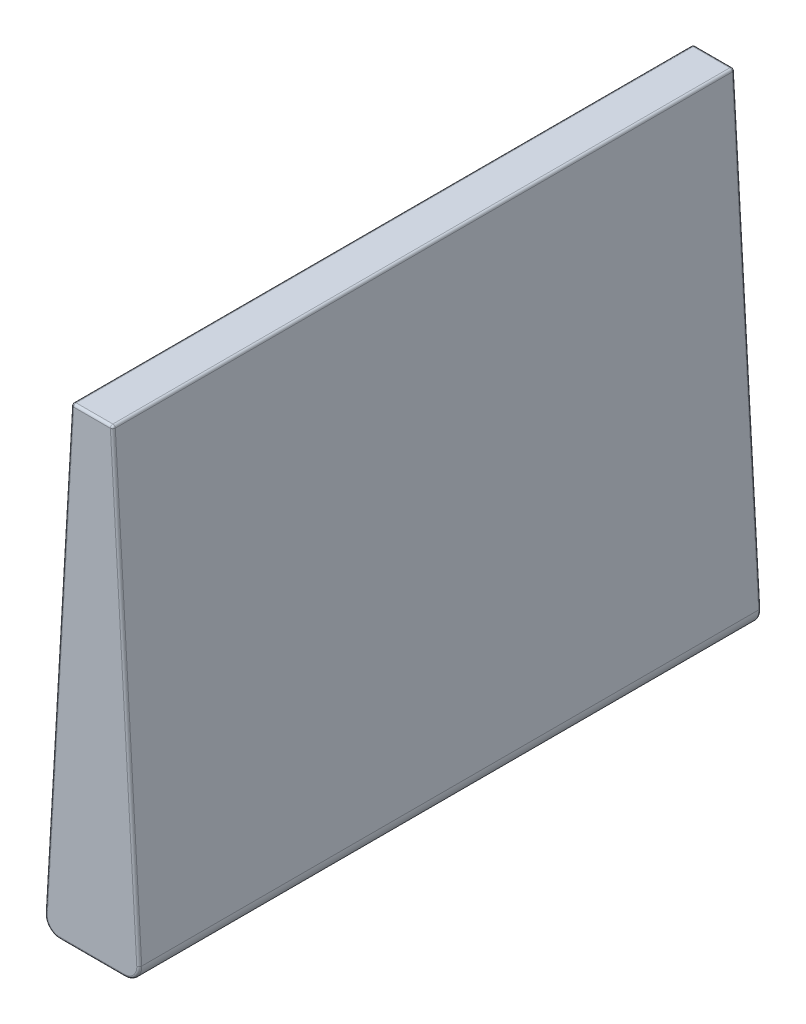
ISO-10303-21;
HEADER;
FILE_DESCRIPTION(('STEP AP214'),'2;1');
FILE_NAME('part.step','',(''),(''),'','','');
FILE_SCHEMA(('AUTOMOTIVE_DESIGN { 1 0 10303 214 1 1 1 1 }'));
ENDSEC;
DATA;
#1=APPLICATION_CONTEXT('core data for automotive mechanical design processes');
#2=APPLICATION_PROTOCOL_DEFINITION('international standard','automotive_design',2000,#1);
#3=PRODUCT_CONTEXT('',#1,'mechanical');
#4=PRODUCT('Part','Part','',(#3));
#5=PRODUCT_RELATED_PRODUCT_CATEGORY('part','',(#4));
#6=PRODUCT_DEFINITION_FORMATION('','',#4);
#7=PRODUCT_DEFINITION_CONTEXT('part definition',#1,'design');
#8=PRODUCT_DEFINITION('design','',#6,#7);
#9=PRODUCT_DEFINITION_SHAPE('','',#8);
#10=(LENGTH_UNIT() NAMED_UNIT(*) SI_UNIT(.MILLI.,.METRE.));
#11=(NAMED_UNIT(*) PLANE_ANGLE_UNIT() SI_UNIT($,.RADIAN.));
#12=(NAMED_UNIT(*) SI_UNIT($,.STERADIAN.) SOLID_ANGLE_UNIT());
#13=UNCERTAINTY_MEASURE_WITH_UNIT(LENGTH_MEASURE(1.E-05),#10,'distance_accuracy_value','');
#14=(GEOMETRIC_REPRESENTATION_CONTEXT(3) GLOBAL_UNCERTAINTY_ASSIGNED_CONTEXT((#13)) GLOBAL_UNIT_ASSIGNED_CONTEXT((#10,
#11,#12)) REPRESENTATION_CONTEXT('',''));
#15=CARTESIAN_POINT('',(0.,0.,0.));
#16=DIRECTION('',(0.,0.,1.));
#17=DIRECTION('',(1.,0.,0.));
#18=AXIS2_PLACEMENT_3D('',#15,#16,#17);
#19=CARTESIAN_POINT('',(454.302847130838,385.661126294718,239.77));
#20=DIRECTION('',(-1.,0.,0.));
#21=DIRECTION('',(0.,-1.,0.));
#22=AXIS2_PLACEMENT_3D('',#19,#20,#21);
#23=SPHERICAL_SURFACE('',#22,3.);
#24=CARTESIAN_POINT('',(454.302847130838,385.661126294718,239.77));
#25=DIRECTION('',(0.,0.,-1.));
#26=DIRECTION('',(-1.,0.,0.));
#27=AXIS2_PLACEMENT_3D('',#24,#25,#26);
#28=CIRCLE('',#27,3.);
#29=CARTESIAN_POINT('',(451.307938308074,385.835829309379,239.77));
#30=VERTEX_POINT('',#29);
#31=CARTESIAN_POINT('',(454.302847130838,388.661126294718,239.77));
#32=VERTEX_POINT('',#31);
#33=EDGE_CURVE('E128',#30,#32,#28,.T.);
#34=ORIENTED_EDGE('',*,*,#33,.F.);
#35=CARTESIAN_POINT('',(454.302847130838,385.661126294718,239.77));
#36=DIRECTION('',(0.0582343382204067,0.998302940921257,0.));
#37=DIRECTION('',(-0.998302940921257,0.0582343382204067,0.));
#38=AXIS2_PLACEMENT_3D('',#35,#36,#37);
#39=CIRCLE('',#38,3.);
#40=CARTESIAN_POINT('',(454.302847130838,385.661126294718,242.77));
#41=VERTEX_POINT('',#40);
#42=EDGE_CURVE('E21',#41,#30,#39,.F.);
#43=ORIENTED_EDGE('',*,*,#42,.F.);
#44=CARTESIAN_POINT('',(454.302847130838,385.661126294718,239.77));
#45=DIRECTION('',(-1.,0.,0.));
#46=DIRECTION('',(0.,0.,1.));
#47=AXIS2_PLACEMENT_3D('',#44,#45,#46);
#48=CIRCLE('',#47,3.);
#49=EDGE_CURVE('E117',#32,#41,#48,.F.);
#50=ORIENTED_EDGE('',*,*,#49,.F.);
#51=EDGE_LOOP('',(#34,#43,#50));
#52=FACE_BOUND('',#51,.T.);
#53=ADVANCED_FACE('F17',(#52),#23,.T.);
#54=CARTESIAN_POINT('',(454.302847130838,385.661126294718,-507.67));
#55=DIRECTION('',(-0.0582343382204347,-0.998302940921256,0.));
#56=DIRECTION('',(0.,0.,1.));
#57=AXIS2_PLACEMENT_3D('',#54,#55,#56);
#58=SPHERICAL_SURFACE('',#57,3.);
#59=CARTESIAN_POINT('',(454.302847130838,385.661126294718,-507.67));
#60=DIRECTION('',(1.,0.,0.));
#61=DIRECTION('',(0.,0.,-1.));
#62=AXIS2_PLACEMENT_3D('',#59,#60,#61);
#63=CIRCLE('',#62,3.);
#64=CARTESIAN_POINT('',(454.302847130838,385.661126294718,-510.67));
#65=VERTEX_POINT('',#64);
#66=CARTESIAN_POINT('',(454.302847130838,388.661126294718,-507.67));
#67=VERTEX_POINT('',#66);
#68=EDGE_CURVE('E252',#65,#67,#63,.T.);
#69=ORIENTED_EDGE('',*,*,#68,.F.);
#70=CARTESIAN_POINT('',(454.302847130838,385.661126294718,-507.67));
#71=DIRECTION('',(-0.0582343382204067,-0.998302940921257,0.));
#72=DIRECTION('',(0.998302940921257,-0.0582343382204067,0.));
#73=AXIS2_PLACEMENT_3D('',#70,#71,#72);
#74=CIRCLE('',#73,3.);
#75=CARTESIAN_POINT('',(451.307938308074,385.835829309379,-507.67));
#76=VERTEX_POINT('',#75);
#77=EDGE_CURVE('E253',#76,#65,#74,.T.);
#78=ORIENTED_EDGE('',*,*,#77,.F.);
#79=CARTESIAN_POINT('',(454.302847130838,385.661126294718,-507.67));
#80=DIRECTION('',(0.,0.,-1.));
#81=DIRECTION('',(-1.,0.,0.));
#82=AXIS2_PLACEMENT_3D('',#79,#80,#81);
#83=CIRCLE('',#82,3.);
#84=EDGE_CURVE('E265',#67,#76,#83,.F.);
#85=ORIENTED_EDGE('',*,*,#84,.F.);
#86=EDGE_LOOP('',(#69,#78,#85));
#87=FACE_BOUND('',#86,.T.);
#88=ADVANCED_FACE('F306',(#87),#58,.T.);
#89=CARTESIAN_POINT('',(451.510652388512,389.310927831157,-513.95));
#90=DIRECTION('',(0.998302940921257,-0.0582343382204067,0.));
#91=DIRECTION('',(0.0582343382204067,0.998302940921257,0.));
#92=AXIS2_PLACEMENT_3D('',#89,#90,#91);
#93=PLANE('',#92);
#94=DIRECTION('',(0.,0.,-1.));
#95=VECTOR('',#94,1.);
#96=CARTESIAN_POINT('',(451.307938308074,385.835829309379,-513.95));
#97=LINE('',#96,#95);
#98=EDGE_CURVE('E267',#76,#30,#97,.F.);
#99=ORIENTED_EDGE('',*,*,#98,.F.);
#100=DIRECTION('',(-0.0582343382204067,-0.998302940921257,0.));
#101=VECTOR('',#100,1.);
#102=CARTESIAN_POINT('',(434.772490193528,102.37100448859,-507.67));
#103=LINE('',#102,#101);
#104=CARTESIAN_POINT('',(419.31785168735,-162.565655617315,-507.67));
#105=VERTEX_POINT('',#104);
#106=EDGE_CURVE('E127',#105,#76,#103,.F.);
#107=ORIENTED_EDGE('',*,*,#106,.F.);
#108=DIRECTION('',(0.,0.,1.));
#109=VECTOR('',#108,1.);
#110=CARTESIAN_POINT('',(419.31785168735,-162.565655617315,-513.95));
#111=LINE('',#110,#109);
#112=CARTESIAN_POINT('',(419.31785168735,-162.565655617315,239.77));
#113=VERTEX_POINT('',#112);
#114=EDGE_CURVE('E296',#113,#105,#111,.F.);
#115=ORIENTED_EDGE('',*,*,#114,.F.);
#116=DIRECTION('',(0.0582343382204067,0.998302940921257,0.));
#117=VECTOR('',#116,1.);
#118=CARTESIAN_POINT('',(434.772490193528,102.37100448859,239.77));
#119=LINE('',#118,#117);
#120=EDGE_CURVE('E134',#30,#113,#119,.F.);
#121=ORIENTED_EDGE('',*,*,#120,.F.);
#122=EDGE_LOOP('',(#99,#107,#115,#121));
#123=FACE_BOUND('',#122,.T.);
#124=ADVANCED_FACE('F309',(#123),#93,.F.);
#125=CARTESIAN_POINT('',(476.510652388512,-175.613873705282,-133.95));
#126=DIRECTION('',(0.,-1.,0.));
#127=DIRECTION('',(0.,0.,-1.));
#128=AXIS2_PLACEMENT_3D('',#125,#126,#127);
#129=PLANE('',#128);
#130=CARTESIAN_POINT('',(476.510652388512,-175.613873705282,233.019999963041));
#131=DIRECTION('',(0.,-1.,0.));
#132=DIRECTION('',(0.,0.,-1.));
#133=AXIS2_PLACEMENT_3D('',#130,#131,#132);
#134=CIRCLE('',#133,2.75);
#135=CARTESIAN_POINT('',(476.510652388512,-175.613873705282,230.269999963041));
#136=VERTEX_POINT('',#135);
#137=EDGE_CURVE('E506',#136,#136,#134,.T.);
#138=ORIENTED_EDGE('',*,*,#137,.T.);
#139=EDGE_LOOP('',(#138));
#140=FACE_BOUND('',#139,.T.);
#141=ADVANCED_FACE('F313',(#140),#129,.T.);
#142=CARTESIAN_POINT('',(476.510652388512,-175.613873705282,-133.95));
#143=DIRECTION('',(0.,-1.,0.));
#144=DIRECTION('',(0.,0.,-1.));
#145=AXIS2_PLACEMENT_3D('',#142,#143,#144);
#146=PLANE('',#145);
#147=CARTESIAN_POINT('',(476.510652388512,-175.613873705282,-500.919999963041));
#148=DIRECTION('',(0.,-1.,0.));
#149=DIRECTION('',(0.,0.,-1.));
#150=AXIS2_PLACEMENT_3D('',#147,#148,#149);
#151=CIRCLE('',#150,2.75);
#152=CARTESIAN_POINT('',(476.510652388512,-175.613873705282,-503.669999963041));
#153=VERTEX_POINT('',#152);
#154=EDGE_CURVE('E151',#153,#153,#151,.T.);
#155=ORIENTED_EDGE('',*,*,#154,.T.);
#156=EDGE_LOOP('',(#155));
#157=FACE_BOUND('',#156,.T.);
#158=ADVANCED_FACE('F316',(#157),#146,.T.);
#159=CARTESIAN_POINT('',(437.767399016292,102.196301473929,239.77));
#160=DIRECTION('',(0.0582343382204067,0.998302940921257,0.));
#161=DIRECTION('',(-0.998302940921257,0.0582343382204067,0.));
#162=AXIS2_PLACEMENT_3D('',#159,#160,#161);
#163=CYLINDRICAL_SURFACE('',#162,3.);
#164=ORIENTED_EDGE('',*,*,#120,.T.);
#165=CARTESIAN_POINT('',(422.312760510114,-162.740358631976,239.77));
#166=DIRECTION('',(-0.0582343382204011,-0.998302940921258,0.));
#167=DIRECTION('',(-0.998302940921258,0.0582343382204011,0.));
#168=AXIS2_PLACEMENT_3D('',#165,#166,#167);
#169=CIRCLE('',#168,3.);
#170=CARTESIAN_POINT('',(422.312760510114,-162.740358631976,242.77));
#171=VERTEX_POINT('',#170);
#172=EDGE_CURVE('E146',#171,#113,#169,.T.);
#173=ORIENTED_EDGE('',*,*,#172,.F.);
#174=DIRECTION('',(-0.058234338220407,-0.998302940921257,0.));
#175=VECTOR('',#174,1.);
#176=CARTESIAN_POINT('',(454.302847130838,385.661126294718,242.77));
#177=LINE('',#176,#175);
#178=EDGE_CURVE('E137',#41,#171,#177,.T.);
#179=ORIENTED_EDGE('',*,*,#178,.F.);
#180=ORIENTED_EDGE('',*,*,#42,.T.);
#181=EDGE_LOOP('',(#164,#173,#179,#180));
#182=FACE_BOUND('',#181,.T.);
#183=ADVANCED_FACE('F144',(#182),#163,.T.);
#184=CARTESIAN_POINT('',(437.287304623933,-163.613873705282,239.77));
#185=DIRECTION('',(0.,0.,1.));
#186=DIRECTION('',(-1.,0.,0.));
#187=AXIS2_PLACEMENT_3D('',#184,#185,#186);
#188=TOROIDAL_SURFACE('',#187,15.,3.);
#189=CARTESIAN_POINT('',(437.287304623933,-163.613873705282,242.77));
#190=DIRECTION('',(0.,0.,-1.));
#191=DIRECTION('',(0.,-1.,0.));
#192=AXIS2_PLACEMENT_3D('',#189,#190,#191);
#193=CIRCLE('',#192,15.);
#194=CARTESIAN_POINT('',(437.287304623933,-178.613873705282,242.77));
#195=VERTEX_POINT('',#194);
#196=EDGE_CURVE('E148',#171,#195,#193,.F.);
#197=ORIENTED_EDGE('',*,*,#196,.F.);
#198=ORIENTED_EDGE('',*,*,#172,.T.);
#199=CARTESIAN_POINT('',(437.287304623933,-163.613873705282,239.77));
#200=DIRECTION('',(0.,0.,1.));
#201=DIRECTION('',(1.,0.,0.));
#202=AXIS2_PLACEMENT_3D('',#199,#200,#201);
#203=CIRCLE('',#202,18.);
#204=CARTESIAN_POINT('',(437.287304623933,-181.613873705282,239.77));
#205=VERTEX_POINT('',#204);
#206=EDGE_CURVE('E300',#205,#113,#203,.F.);
#207=ORIENTED_EDGE('',*,*,#206,.F.);
#208=CARTESIAN_POINT('',(437.287304623933,-178.613873705282,239.77));
#209=DIRECTION('',(1.,0.,0.));
#210=DIRECTION('',(0.,0.,-1.));
#211=AXIS2_PLACEMENT_3D('',#208,#209,#210);
#212=CIRCLE('',#211,3.);
#213=EDGE_CURVE('E470',#195,#205,#212,.T.);
#214=ORIENTED_EDGE('',*,*,#213,.F.);
#215=EDGE_LOOP('',(#197,#198,#207,#214));
#216=FACE_BOUND('',#215,.T.);
#217=ADVANCED_FACE('F277',(#216),#188,.T.);
#218=CARTESIAN_POINT('',(454.302847130838,385.661126294718,-513.95));
#219=DIRECTION('',(0.,0.,-1.));
#220=DIRECTION('',(-1.,0.,0.));
#221=AXIS2_PLACEMENT_3D('',#218,#219,#220);
#222=CYLINDRICAL_SURFACE('',#221,3.);
#223=ORIENTED_EDGE('',*,*,#33,.T.);
#224=DIRECTION('',(0.,0.,1.));
#225=VECTOR('',#224,1.);
#226=CARTESIAN_POINT('',(454.302847130838,388.661126294718,-133.95));
#227=LINE('',#226,#225);
#228=EDGE_CURVE('E141',#67,#32,#227,.T.);
#229=ORIENTED_EDGE('',*,*,#228,.F.);
#230=ORIENTED_EDGE('',*,*,#84,.T.);
#231=ORIENTED_EDGE('',*,*,#98,.T.);
#232=EDGE_LOOP('',(#223,#229,#230,#231));
#233=FACE_BOUND('',#232,.T.);
#234=ADVANCED_FACE('F282',(#233),#222,.T.);
#235=CARTESIAN_POINT('',(476.510652388512,385.661126294718,239.77));
#236=DIRECTION('',(-1.,0.,0.));
#237=DIRECTION('',(0.,0.,1.));
#238=AXIS2_PLACEMENT_3D('',#235,#236,#237);
#239=CYLINDRICAL_SURFACE('',#238,3.);
#240=CARTESIAN_POINT('',(498.718457646185,385.661126294718,239.77));
#241=DIRECTION('',(-1.,0.,0.));
#242=DIRECTION('',(0.,-1.,0.));
#243=AXIS2_PLACEMENT_3D('',#240,#241,#242);
#244=CIRCLE('',#243,3.);
#245=CARTESIAN_POINT('',(498.718457646185,388.661126294718,239.77));
#246=VERTEX_POINT('',#245);
#247=CARTESIAN_POINT('',(498.718457646185,385.661126294718,242.77));
#248=VERTEX_POINT('',#247);
#249=EDGE_CURVE('E405',#246,#248,#244,.F.);
#250=ORIENTED_EDGE('',*,*,#249,.F.);
#251=DIRECTION('',(1.,0.,0.));
#252=VECTOR('',#251,1.);
#253=CARTESIAN_POINT('',(495.010652388512,388.661126294718,239.77));
#254=LINE('',#253,#252);
#255=EDGE_CURVE('E124',#32,#246,#254,.T.);
#256=ORIENTED_EDGE('',*,*,#255,.F.);
#257=ORIENTED_EDGE('',*,*,#49,.T.);
#258=DIRECTION('',(1.,0.,0.));
#259=VECTOR('',#258,1.);
#260=CARTESIAN_POINT('',(510.956219503305,385.661126294718,242.77));
#261=LINE('',#260,#259);
#262=EDGE_CURVE('E122',#248,#41,#261,.F.);
#263=ORIENTED_EDGE('',*,*,#262,.F.);
#264=EDGE_LOOP('',(#250,#256,#257,#263));
#265=FACE_BOUND('',#264,.T.);
#266=ADVANCED_FACE('F120',(#265),#239,.T.);
#267=CARTESIAN_POINT('',(437.767399016292,102.196301473929,-507.67));
#268=DIRECTION('',(-0.0582343382204067,-0.998302940921257,0.));
#269=DIRECTION('',(0.998302940921257,-0.0582343382204067,0.));
#270=AXIS2_PLACEMENT_3D('',#267,#268,#269);
#271=CYLINDRICAL_SURFACE('',#270,3.);
#272=ORIENTED_EDGE('',*,*,#106,.T.);
#273=ORIENTED_EDGE('',*,*,#77,.T.);
#274=DIRECTION('',(0.058234338220407,0.998302940921257,0.));
#275=VECTOR('',#274,1.);
#276=CARTESIAN_POINT('',(422.312760510114,-162.740358631976,-510.67));
#277=LINE('',#276,#275);
#278=CARTESIAN_POINT('',(422.312760510114,-162.740358631976,-510.67));
#279=VERTEX_POINT('',#278);
#280=EDGE_CURVE('E402',#279,#65,#277,.T.);
#281=ORIENTED_EDGE('',*,*,#280,.F.);
#282=CARTESIAN_POINT('',(422.312760510114,-162.740358631976,-507.67));
#283=DIRECTION('',(-0.0582343382203922,-0.998302940921258,0.));
#284=DIRECTION('',(-0.998302940921258,0.0582343382203922,0.));
#285=AXIS2_PLACEMENT_3D('',#282,#283,#284);
#286=CIRCLE('',#285,3.);
#287=EDGE_CURVE('E245',#105,#279,#286,.T.);
#288=ORIENTED_EDGE('',*,*,#287,.F.);
#289=EDGE_LOOP('',(#272,#273,#281,#288));
#290=FACE_BOUND('',#289,.T.);
#291=ADVANCED_FACE('F238',(#290),#271,.T.);
#292=CARTESIAN_POINT('',(437.287304623933,-163.613873705282,-507.67));
#293=DIRECTION('',(0.,0.,1.));
#294=DIRECTION('',(-1.,0.,0.));
#295=AXIS2_PLACEMENT_3D('',#292,#293,#294);
#296=TOROIDAL_SURFACE('',#295,15.,3.);
#297=CARTESIAN_POINT('',(437.287304623933,-163.613873705282,-510.67));
#298=DIRECTION('',(0.,0.,1.));
#299=DIRECTION('',(-0.998302940921258,0.0582343382203918,0.));
#300=AXIS2_PLACEMENT_3D('',#297,#298,#299);
#301=CIRCLE('',#300,15.0000000000001);
#302=CARTESIAN_POINT('',(437.287304623933,-178.613873705282,-510.67));
#303=VERTEX_POINT('',#302);
#304=EDGE_CURVE('E398',#303,#279,#301,.F.);
#305=ORIENTED_EDGE('',*,*,#304,.F.);
#306=CARTESIAN_POINT('',(437.287304623933,-178.613873705282,-507.67));
#307=DIRECTION('',(-1.,0.,0.));
#308=DIRECTION('',(0.,0.,1.));
#309=AXIS2_PLACEMENT_3D('',#306,#307,#308);
#310=CIRCLE('',#309,3.);
#311=CARTESIAN_POINT('',(437.287304623933,-181.613873705282,-507.67));
#312=VERTEX_POINT('',#311);
#313=EDGE_CURVE('E149',#312,#303,#310,.F.);
#314=ORIENTED_EDGE('',*,*,#313,.F.);
#315=CARTESIAN_POINT('',(437.287304623933,-163.613873705282,-507.67));
#316=DIRECTION('',(0.,0.,1.));
#317=DIRECTION('',(1.,0.,0.));
#318=AXIS2_PLACEMENT_3D('',#315,#316,#317);
#319=CIRCLE('',#318,18.);
#320=EDGE_CURVE('E299',#105,#312,#319,.T.);
#321=ORIENTED_EDGE('',*,*,#320,.F.);
#322=ORIENTED_EDGE('',*,*,#287,.T.);
#323=EDGE_LOOP('',(#305,#314,#321,#322));
#324=FACE_BOUND('',#323,.T.);
#325=ADVANCED_FACE('F232',(#324),#296,.T.);
#326=CARTESIAN_POINT('',(476.510652388512,385.661126294718,-507.67));
#327=DIRECTION('',(1.,0.,0.));
#328=DIRECTION('',(0.,0.,-1.));
#329=AXIS2_PLACEMENT_3D('',#326,#327,#328);
#330=CYLINDRICAL_SURFACE('',#329,3.);
#331=ORIENTED_EDGE('',*,*,#68,.T.);
#332=DIRECTION('',(1.,0.,0.));
#333=VECTOR('',#332,1.);
#334=CARTESIAN_POINT('',(495.010652388512,388.661126294718,-507.67));
#335=LINE('',#334,#333);
#336=CARTESIAN_POINT('',(498.718457646185,388.661126294718,-507.67));
#337=VERTEX_POINT('',#336);
#338=EDGE_CURVE('E419',#337,#67,#335,.F.);
#339=ORIENTED_EDGE('',*,*,#338,.F.);
#340=CARTESIAN_POINT('',(498.718457646185,385.661126294718,-507.67));
#341=DIRECTION('',(1.,0.,0.));
#342=DIRECTION('',(0.,-1.,0.));
#343=AXIS2_PLACEMENT_3D('',#340,#341,#342);
#344=CIRCLE('',#343,3.);
#345=CARTESIAN_POINT('',(498.718457646186,385.66112629472,-510.67));
#346=VERTEX_POINT('',#345);
#347=EDGE_CURVE('E464',#346,#337,#344,.T.);
#348=ORIENTED_EDGE('',*,*,#347,.F.);
#349=DIRECTION('',(-1.,0.,0.));
#350=VECTOR('',#349,1.);
#351=CARTESIAN_POINT('',(442.065085273718,385.661126294718,-510.67));
#352=LINE('',#351,#350);
#353=EDGE_CURVE('E399',#65,#346,#352,.F.);
#354=ORIENTED_EDGE('',*,*,#353,.F.);
#355=EDGE_LOOP('',(#331,#339,#348,#354));
#356=FACE_BOUND('',#355,.T.);
#357=ADVANCED_FACE('F237',(#356),#330,.T.);
#358=CARTESIAN_POINT('',(437.287304623933,-163.613873705282,-513.95));
#359=DIRECTION('',(0.,0.,1.));
#360=DIRECTION('',(1.,0.,0.));
#361=AXIS2_PLACEMENT_3D('',#358,#359,#360);
#362=CYLINDRICAL_SURFACE('',#361,18.);
#363=ORIENTED_EDGE('',*,*,#320,.T.);
#364=DIRECTION('',(0.,0.,-1.));
#365=VECTOR('',#364,1.);
#366=CARTESIAN_POINT('',(437.287304623933,-181.613873705282,-133.95));
#367=LINE('',#366,#365);
#368=EDGE_CURVE('E223',#205,#312,#367,.T.);
#369=ORIENTED_EDGE('',*,*,#368,.F.);
#370=ORIENTED_EDGE('',*,*,#206,.T.);
#371=ORIENTED_EDGE('',*,*,#114,.T.);
#372=EDGE_LOOP('',(#363,#369,#370,#371));
#373=FACE_BOUND('',#372,.T.);
#374=ADVANCED_FACE('F554',(#373),#362,.T.);
#375=CARTESIAN_POINT('',(476.510652388512,-178.613873705282,239.77));
#376=DIRECTION('',(1.,0.,0.));
#377=DIRECTION('',(0.,0.,-1.));
#378=AXIS2_PLACEMENT_3D('',#375,#376,#377);
#379=CYLINDRICAL_SURFACE('',#378,3.);
#380=DIRECTION('',(1.,0.,0.));
#381=VECTOR('',#380,1.);
#382=CARTESIAN_POINT('',(447.804380484607,-181.613873705282,239.77));
#383=LINE('',#382,#381);
#384=CARTESIAN_POINT('',(515.73400015309,-181.613873705282,239.77));
#385=VERTEX_POINT('',#384);
#386=EDGE_CURVE('E468',#385,#205,#383,.F.);
#387=ORIENTED_EDGE('',*,*,#386,.F.);
#388=CARTESIAN_POINT('',(515.73400015309,-178.613873705282,239.77));
#389=DIRECTION('',(1.,0.,0.));
#390=DIRECTION('',(0.,-1.,0.));
#391=AXIS2_PLACEMENT_3D('',#388,#389,#390);
#392=CIRCLE('',#391,3.);
#393=CARTESIAN_POINT('',(515.73400015309,-178.613873705282,242.77));
#394=VERTEX_POINT('',#393);
#395=EDGE_CURVE('E216',#394,#385,#392,.T.);
#396=ORIENTED_EDGE('',*,*,#395,.F.);
#397=DIRECTION('',(1.,0.,0.));
#398=VECTOR('',#397,1.);
#399=CARTESIAN_POINT('',(510.956219503305,-178.613873705282,242.77));
#400=LINE('',#399,#398);
#401=EDGE_CURVE('E142',#195,#394,#400,.T.);
#402=ORIENTED_EDGE('',*,*,#401,.F.);
#403=ORIENTED_EDGE('',*,*,#213,.T.);
#404=EDGE_LOOP('',(#387,#396,#402,#403));
#405=FACE_BOUND('',#404,.T.);
#406=ADVANCED_FACE('F466',(#405),#379,.T.);
#407=CARTESIAN_POINT('',(476.510652388512,-183.213873705282,233.019999963041));
#408=DIRECTION('',(0.,-1.,0.));
#409=DIRECTION('',(0.,0.,-1.));
#410=AXIS2_PLACEMENT_3D('',#407,#408,#409);
#411=CYLINDRICAL_SURFACE('',#410,2.75);
#412=CARTESIAN_POINT('',(476.510652388512,-181.613873705282,233.019999963041));
#413=DIRECTION('',(0.,-1.,0.));
#414=DIRECTION('',(0.,0.,-1.));
#415=AXIS2_PLACEMENT_3D('',#412,#413,#414);
#416=CIRCLE('',#415,2.75);
#417=CARTESIAN_POINT('',(476.510652388512,-181.613873705282,230.269999963041));
#418=VERTEX_POINT('',#417);
#419=EDGE_CURVE('E475',#418,#418,#416,.F.);
#420=ORIENTED_EDGE('',*,*,#419,.F.);
#421=EDGE_LOOP('',(#420));
#422=FACE_BOUND('',#421,.T.);
#423=ORIENTED_EDGE('',*,*,#137,.F.);
#424=EDGE_LOOP('',(#423));
#425=FACE_BOUND('',#424,.T.);
#426=ADVANCED_FACE('F544',(#422,#425),#411,.F.);
#427=CARTESIAN_POINT('',(476.510652388512,-183.213873705282,-500.919999963041));
#428=DIRECTION('',(0.,-1.,0.));
#429=DIRECTION('',(0.,0.,-1.));
#430=AXIS2_PLACEMENT_3D('',#427,#428,#429);
#431=CYLINDRICAL_SURFACE('',#430,2.75);
#432=CARTESIAN_POINT('',(476.510652388512,-181.613873705282,-500.919999963041));
#433=DIRECTION('',(0.,-1.,0.));
#434=DIRECTION('',(0.,0.,-1.));
#435=AXIS2_PLACEMENT_3D('',#432,#433,#434);
#436=CIRCLE('',#435,2.75);
#437=CARTESIAN_POINT('',(476.510652388512,-181.613873705282,-503.669999963041));
#438=VERTEX_POINT('',#437);
#439=EDGE_CURVE('E538',#438,#438,#436,.F.);
#440=ORIENTED_EDGE('',*,*,#439,.F.);
#441=EDGE_LOOP('',(#440));
#442=FACE_BOUND('',#441,.T.);
#443=ORIENTED_EDGE('',*,*,#154,.F.);
#444=EDGE_LOOP('',(#443));
#445=FACE_BOUND('',#444,.T.);
#446=ADVANCED_FACE('F547',(#442,#445),#431,.F.);
#447=CARTESIAN_POINT('',(476.510652388512,-178.613873705282,-507.67));
#448=DIRECTION('',(-1.,0.,0.));
#449=DIRECTION('',(0.,0.,1.));
#450=AXIS2_PLACEMENT_3D('',#447,#448,#449);
#451=CYLINDRICAL_SURFACE('',#450,3.);
#452=DIRECTION('',(1.,0.,0.));
#453=VECTOR('',#452,1.);
#454=CARTESIAN_POINT('',(447.804380484607,-181.613873705282,-507.67));
#455=LINE('',#454,#453);
#456=CARTESIAN_POINT('',(515.73400015309,-181.613873705282,-507.67));
#457=VERTEX_POINT('',#456);
#458=EDGE_CURVE('E476',#312,#457,#455,.T.);
#459=ORIENTED_EDGE('',*,*,#458,.F.);
#460=ORIENTED_EDGE('',*,*,#313,.T.);
#461=DIRECTION('',(-1.,0.,0.));
#462=VECTOR('',#461,1.);
#463=CARTESIAN_POINT('',(442.065085273718,-178.613873705282,-510.67));
#464=LINE('',#463,#462);
#465=CARTESIAN_POINT('',(515.73400015309,-178.613873705282,-510.67));
#466=VERTEX_POINT('',#465);
#467=EDGE_CURVE('E391',#466,#303,#464,.T.);
#468=ORIENTED_EDGE('',*,*,#467,.F.);
#469=CARTESIAN_POINT('',(515.73400015309,-178.613873705282,-507.67));
#470=DIRECTION('',(1.,0.,0.));
#471=DIRECTION('',(0.,-1.,0.));
#472=AXIS2_PLACEMENT_3D('',#469,#470,#471);
#473=CIRCLE('',#472,3.);
#474=EDGE_CURVE('E177',#457,#466,#473,.T.);
#475=ORIENTED_EDGE('',*,*,#474,.F.);
#476=EDGE_LOOP('',(#459,#460,#468,#475));
#477=FACE_BOUND('',#476,.T.);
#478=ADVANCED_FACE('F448',(#477),#451,.T.);
#479=CARTESIAN_POINT('',(510.956219503305,110.210927831157,242.77));
#480=DIRECTION('',(0.,0.,1.));
#481=DIRECTION('',(1.,0.,0.));
#482=AXIS2_PLACEMENT_3D('',#479,#480,#481);
#483=PLANE('',#482);
#484=DIRECTION('',(0.0582343382204067,-0.998302940921257,0.));
#485=VECTOR('',#484,1.);
#486=CARTESIAN_POINT('',(515.253905760731,102.196301473929,242.77));
#487=LINE('',#486,#485);
#488=CARTESIAN_POINT('',(530.708544266909,-162.740358631976,242.77));
#489=VERTEX_POINT('',#488);
#490=EDGE_CURVE('E140',#248,#489,#487,.T.);
#491=ORIENTED_EDGE('',*,*,#490,.F.);
#492=ORIENTED_EDGE('',*,*,#262,.T.);
#493=ORIENTED_EDGE('',*,*,#178,.T.);
#494=ORIENTED_EDGE('',*,*,#196,.T.);
#495=ORIENTED_EDGE('',*,*,#401,.T.);
#496=CARTESIAN_POINT('',(515.73400015309,-163.613873705282,242.77));
#497=DIRECTION('',(0.,0.,-1.));
#498=DIRECTION('',(0.998302940921258,0.0582343382203965,0.));
#499=AXIS2_PLACEMENT_3D('',#496,#497,#498);
#500=CIRCLE('',#499,15.0000000000003);
#501=EDGE_CURVE('E224',#489,#394,#500,.T.);
#502=ORIENTED_EDGE('',*,*,#501,.F.);
#503=EDGE_LOOP('',(#491,#492,#493,#494,#495,#502));
#504=FACE_BOUND('',#503,.T.);
#505=ADVANCED_FACE('F136',(#504),#483,.T.);
#506=CARTESIAN_POINT('',(495.010652388512,388.661126294718,-133.95));
#507=DIRECTION('',(0.,1.,0.));
#508=DIRECTION('',(0.,0.,1.));
#509=AXIS2_PLACEMENT_3D('',#506,#507,#508);
#510=PLANE('',#509);
#511=DIRECTION('',(0.,0.,1.));
#512=VECTOR('',#511,1.);
#513=CARTESIAN_POINT('',(498.718457646185,388.661126294718,-513.95));
#514=LINE('',#513,#512);
#515=EDGE_CURVE('E165',#337,#246,#514,.T.);
#516=ORIENTED_EDGE('',*,*,#515,.F.);
#517=ORIENTED_EDGE('',*,*,#338,.T.);
#518=ORIENTED_EDGE('',*,*,#228,.T.);
#519=ORIENTED_EDGE('',*,*,#255,.T.);
#520=EDGE_LOOP('',(#516,#517,#518,#519));
#521=FACE_BOUND('',#520,.T.);
#522=ADVANCED_FACE('F447',(#521),#510,.T.);
#523=CARTESIAN_POINT('',(498.718457646185,385.661126294718,239.77));
#524=DIRECTION('',(-1.,0.,0.));
#525=DIRECTION('',(0.,-1.,0.));
#526=AXIS2_PLACEMENT_3D('',#523,#524,#525);
#527=SPHERICAL_SURFACE('',#526,3.);
#528=CARTESIAN_POINT('',(498.718457646185,385.661126294718,239.77));
#529=DIRECTION('',(0.,0.,1.));
#530=DIRECTION('',(1.,0.,0.));
#531=AXIS2_PLACEMENT_3D('',#528,#529,#530);
#532=CIRCLE('',#531,3.);
#533=CARTESIAN_POINT('',(501.713366468949,385.835829309379,239.77));
#534=VERTEX_POINT('',#533);
#535=EDGE_CURVE('E355',#246,#534,#532,.F.);
#536=ORIENTED_EDGE('',*,*,#535,.F.);
#537=ORIENTED_EDGE('',*,*,#249,.T.);
#538=CARTESIAN_POINT('',(498.718457646185,385.661126294718,239.77));
#539=DIRECTION('',(0.0582343382204067,-0.998302940921257,0.));
#540=DIRECTION('',(0.998302940921257,0.0582343382204067,0.));
#541=AXIS2_PLACEMENT_3D('',#538,#539,#540);
#542=CIRCLE('',#541,3.);
#543=EDGE_CURVE('E161',#534,#248,#542,.T.);
#544=ORIENTED_EDGE('',*,*,#543,.F.);
#545=EDGE_LOOP('',(#536,#537,#544));
#546=FACE_BOUND('',#545,.T.);
#547=ADVANCED_FACE('F384',(#546),#527,.T.);
#548=CARTESIAN_POINT('',(442.065085273718,110.210927831157,-510.67));
#549=DIRECTION('',(0.,0.,-1.));
#550=DIRECTION('',(-1.,0.,0.));
#551=AXIS2_PLACEMENT_3D('',#548,#549,#550);
#552=PLANE('',#551);
#553=ORIENTED_EDGE('',*,*,#467,.T.);
#554=ORIENTED_EDGE('',*,*,#304,.T.);
#555=ORIENTED_EDGE('',*,*,#280,.T.);
#556=ORIENTED_EDGE('',*,*,#353,.T.);
#557=DIRECTION('',(-0.0582343382204067,0.998302940921257,0.));
#558=VECTOR('',#557,1.);
#559=CARTESIAN_POINT('',(515.253905760731,102.196301473929,-510.67));
#560=LINE('',#559,#558);
#561=CARTESIAN_POINT('',(530.708544266909,-162.740358631976,-510.67));
#562=VERTEX_POINT('',#561);
#563=EDGE_CURVE('E535',#562,#346,#560,.T.);
#564=ORIENTED_EDGE('',*,*,#563,.F.);
#565=CARTESIAN_POINT('',(515.73400015309,-163.613873705282,-510.67));
#566=DIRECTION('',(0.,0.,1.));
#567=DIRECTION('',(0.,-1.,0.));
#568=AXIS2_PLACEMENT_3D('',#565,#566,#567);
#569=CIRCLE('',#568,15.);
#570=EDGE_CURVE('E171',#466,#562,#569,.T.);
#571=ORIENTED_EDGE('',*,*,#570,.F.);
#572=EDGE_LOOP('',(#553,#554,#555,#556,#564,#571));
#573=FACE_BOUND('',#572,.T.);
#574=ADVANCED_FACE('F375',(#573),#552,.T.);
#575=CARTESIAN_POINT('',(498.718457646185,385.661126294718,-507.67));
#576=DIRECTION('',(1.,0.,0.));
#577=DIRECTION('',(0.,-1.,0.));
#578=AXIS2_PLACEMENT_3D('',#575,#576,#577);
#579=SPHERICAL_SURFACE('',#578,3.);
#580=CARTESIAN_POINT('',(498.718457646185,385.661126294718,-507.67));
#581=DIRECTION('',(0.,0.,1.));
#582=DIRECTION('',(1.,0.,0.));
#583=AXIS2_PLACEMENT_3D('',#580,#581,#582);
#584=CIRCLE('',#583,3.);
#585=CARTESIAN_POINT('',(501.713366468949,385.835829309379,-507.67));
#586=VERTEX_POINT('',#585);
#587=EDGE_CURVE('E352',#586,#337,#584,.T.);
#588=ORIENTED_EDGE('',*,*,#587,.F.);
#589=CARTESIAN_POINT('',(498.718457646185,385.661126294718,-507.67));
#590=DIRECTION('',(-0.0582343382204067,0.998302940921257,0.));
#591=DIRECTION('',(-0.998302940921257,-0.0582343382204067,0.));
#592=AXIS2_PLACEMENT_3D('',#589,#590,#591);
#593=CIRCLE('',#592,3.);
#594=EDGE_CURVE('E410',#346,#586,#593,.F.);
#595=ORIENTED_EDGE('',*,*,#594,.F.);
#596=ORIENTED_EDGE('',*,*,#347,.T.);
#597=EDGE_LOOP('',(#588,#595,#596));
#598=FACE_BOUND('',#597,.T.);
#599=ADVANCED_FACE('F206',(#598),#579,.T.);
#600=CARTESIAN_POINT('',(515.73400015309,-163.613873705282,239.77));
#601=DIRECTION('',(0.,0.,1.));
#602=DIRECTION('',(-1.,0.,0.));
#603=AXIS2_PLACEMENT_3D('',#600,#601,#602);
#604=TOROIDAL_SURFACE('',#603,15.0000000000001,3.);
#605=ORIENTED_EDGE('',*,*,#501,.T.);
#606=ORIENTED_EDGE('',*,*,#395,.T.);
#607=CARTESIAN_POINT('',(515.73400015309,-163.613873705282,239.77));
#608=DIRECTION('',(0.,0.,1.));
#609=DIRECTION('',(1.,0.,0.));
#610=AXIS2_PLACEMENT_3D('',#607,#608,#609);
#611=CIRCLE('',#610,18.);
#612=CARTESIAN_POINT('',(533.703453089673,-162.565655617315,239.77));
#613=VERTEX_POINT('',#612);
#614=EDGE_CURVE('E197',#613,#385,#611,.F.);
#615=ORIENTED_EDGE('',*,*,#614,.F.);
#616=CARTESIAN_POINT('',(530.708544266909,-162.740358631976,239.77));
#617=DIRECTION('',(0.0582343382204067,-0.998302940921257,0.));
#618=DIRECTION('',(0.998302940921257,0.0582343382204067,0.));
#619=AXIS2_PLACEMENT_3D('',#616,#617,#618);
#620=CIRCLE('',#619,3.);
#621=EDGE_CURVE('E160',#489,#613,#620,.F.);
#622=ORIENTED_EDGE('',*,*,#621,.F.);
#623=EDGE_LOOP('',(#605,#606,#615,#622));
#624=FACE_BOUND('',#623,.T.);
#625=ADVANCED_FACE('F202',(#624),#604,.T.);
#626=CARTESIAN_POINT('',(447.804380484607,-181.613873705282,-133.95));
#627=DIRECTION('',(0.,-1.,0.));
#628=DIRECTION('',(0.,0.,-1.));
#629=AXIS2_PLACEMENT_3D('',#626,#627,#628);
#630=PLANE('',#629);
#631=ORIENTED_EDGE('',*,*,#439,.T.);
#632=EDGE_LOOP('',(#631));
#633=FACE_BOUND('',#632,.T.);
#634=ORIENTED_EDGE('',*,*,#419,.T.);
#635=EDGE_LOOP('',(#634));
#636=FACE_BOUND('',#635,.T.);
#637=DIRECTION('',(0.,0.,1.));
#638=VECTOR('',#637,1.);
#639=CARTESIAN_POINT('',(515.73400015309,-181.613873705282,-513.95));
#640=LINE('',#639,#638);
#641=EDGE_CURVE('E478',#385,#457,#640,.F.);
#642=ORIENTED_EDGE('',*,*,#641,.F.);
#643=ORIENTED_EDGE('',*,*,#386,.T.);
#644=ORIENTED_EDGE('',*,*,#368,.T.);
#645=ORIENTED_EDGE('',*,*,#458,.T.);
#646=EDGE_LOOP('',(#642,#643,#644,#645));
#647=FACE_BOUND('',#646,.T.);
#648=ADVANCED_FACE('F191',(#633,#636,#647),#630,.T.);
#649=CARTESIAN_POINT('',(515.73400015309,-163.613873705282,-507.67));
#650=DIRECTION('',(0.,0.,1.));
#651=DIRECTION('',(-1.,0.,0.));
#652=AXIS2_PLACEMENT_3D('',#649,#650,#651);
#653=TOROIDAL_SURFACE('',#652,15.0000000000001,3.);
#654=ORIENTED_EDGE('',*,*,#570,.T.);
#655=CARTESIAN_POINT('',(530.708544266909,-162.740358631976,-507.67));
#656=DIRECTION('',(-0.0582343382204067,0.998302940921257,0.));
#657=DIRECTION('',(-0.998302940921257,-0.0582343382204067,0.));
#658=AXIS2_PLACEMENT_3D('',#655,#656,#657);
#659=CIRCLE('',#658,3.);
#660=CARTESIAN_POINT('',(533.703453089673,-162.565655617315,-507.67));
#661=VERTEX_POINT('',#660);
#662=EDGE_CURVE('E408',#661,#562,#659,.T.);
#663=ORIENTED_EDGE('',*,*,#662,.F.);
#664=CARTESIAN_POINT('',(515.73400015309,-163.613873705282,-507.67));
#665=DIRECTION('',(0.,0.,1.));
#666=DIRECTION('',(1.,0.,0.));
#667=AXIS2_PLACEMENT_3D('',#664,#665,#666);
#668=CIRCLE('',#667,18.);
#669=EDGE_CURVE('E35',#457,#661,#668,.T.);
#670=ORIENTED_EDGE('',*,*,#669,.F.);
#671=ORIENTED_EDGE('',*,*,#474,.T.);
#672=EDGE_LOOP('',(#654,#663,#670,#671));
#673=FACE_BOUND('',#672,.T.);
#674=ADVANCED_FACE('F179',(#673),#653,.T.);
#675=CARTESIAN_POINT('',(515.253905760731,102.196301473929,239.77));
#676=DIRECTION('',(0.0582343382204067,-0.998302940921257,0.));
#677=DIRECTION('',(0.998302940921257,0.0582343382204067,0.));
#678=AXIS2_PLACEMENT_3D('',#675,#676,#677);
#679=CYLINDRICAL_SURFACE('',#678,3.);
#680=ORIENTED_EDGE('',*,*,#621,.T.);
#681=DIRECTION('',(0.0582343382204067,-0.998302940921257,0.));
#682=VECTOR('',#681,1.);
#683=CARTESIAN_POINT('',(536.510652388512,-210.689072168843,239.77));
#684=LINE('',#683,#682);
#685=EDGE_CURVE('E359',#613,#534,#684,.F.);
#686=ORIENTED_EDGE('',*,*,#685,.T.);
#687=ORIENTED_EDGE('',*,*,#543,.T.);
#688=ORIENTED_EDGE('',*,*,#490,.T.);
#689=EDGE_LOOP('',(#680,#686,#687,#688));
#690=FACE_BOUND('',#689,.T.);
#691=ADVANCED_FACE('F190',(#690),#679,.T.);
#692=CARTESIAN_POINT('',(498.718457646185,385.661126294718,-513.95));
#693=DIRECTION('',(0.,0.,1.));
#694=DIRECTION('',(1.,0.,0.));
#695=AXIS2_PLACEMENT_3D('',#692,#693,#694);
#696=CYLINDRICAL_SURFACE('',#695,3.);
#697=DIRECTION('',(0.,0.,1.));
#698=VECTOR('',#697,1.);
#699=CARTESIAN_POINT('',(501.713366468949,385.835829309379,-513.95));
#700=LINE('',#699,#698);
#701=EDGE_CURVE('E349',#534,#586,#700,.F.);
#702=ORIENTED_EDGE('',*,*,#701,.T.);
#703=ORIENTED_EDGE('',*,*,#587,.T.);
#704=ORIENTED_EDGE('',*,*,#515,.T.);
#705=ORIENTED_EDGE('',*,*,#535,.T.);
#706=EDGE_LOOP('',(#702,#703,#704,#705));
#707=FACE_BOUND('',#706,.T.);
#708=ADVANCED_FACE('F338',(#707),#696,.T.);
#709=CARTESIAN_POINT('',(515.253905760731,102.196301473929,-507.67));
#710=DIRECTION('',(-0.0582343382204067,0.998302940921257,0.));
#711=DIRECTION('',(-0.998302940921257,-0.0582343382204067,0.));
#712=AXIS2_PLACEMENT_3D('',#709,#710,#711);
#713=CYLINDRICAL_SURFACE('',#712,3.);
#714=DIRECTION('',(0.0582343382204067,-0.998302940921257,0.));
#715=VECTOR('',#714,1.);
#716=CARTESIAN_POINT('',(536.510652388512,-210.689072168843,-507.67));
#717=LINE('',#716,#715);
#718=EDGE_CURVE('E27',#586,#661,#717,.T.);
#719=ORIENTED_EDGE('',*,*,#718,.T.);
#720=ORIENTED_EDGE('',*,*,#662,.T.);
#721=ORIENTED_EDGE('',*,*,#563,.T.);
#722=ORIENTED_EDGE('',*,*,#594,.T.);
#723=EDGE_LOOP('',(#719,#720,#721,#722));
#724=FACE_BOUND('',#723,.T.);
#725=ADVANCED_FACE('F333',(#724),#713,.T.);
#726=CARTESIAN_POINT('',(515.73400015309,-163.613873705282,-513.95));
#727=DIRECTION('',(0.,0.,1.));
#728=DIRECTION('',(1.,0.,0.));
#729=AXIS2_PLACEMENT_3D('',#726,#727,#728);
#730=CYLINDRICAL_SURFACE('',#729,18.);
#731=ORIENTED_EDGE('',*,*,#669,.T.);
#732=DIRECTION('',(0.,0.,1.));
#733=VECTOR('',#732,1.);
#734=CARTESIAN_POINT('',(533.703453089673,-162.565655617315,-513.95));
#735=LINE('',#734,#733);
#736=EDGE_CURVE('E11',#661,#613,#735,.T.);
#737=ORIENTED_EDGE('',*,*,#736,.T.);
#738=ORIENTED_EDGE('',*,*,#614,.T.);
#739=ORIENTED_EDGE('',*,*,#641,.T.);
#740=EDGE_LOOP('',(#731,#737,#738,#739));
#741=FACE_BOUND('',#740,.T.);
#742=ADVANCED_FACE('F327',(#741),#730,.T.);
#743=CARTESIAN_POINT('',(536.510652388512,-210.689072168843,-513.95));
#744=DIRECTION('',(-0.998302940921257,-0.0582343382204067,0.));
#745=DIRECTION('',(0.0582343382204067,-0.998302940921257,0.));
#746=AXIS2_PLACEMENT_3D('',#743,#744,#745);
#747=PLANE('',#746);
#748=ORIENTED_EDGE('',*,*,#718,.F.);
#749=ORIENTED_EDGE('',*,*,#701,.F.);
#750=ORIENTED_EDGE('',*,*,#685,.F.);
#751=ORIENTED_EDGE('',*,*,#736,.F.);
#752=EDGE_LOOP('',(#748,#749,#750,#751));
#753=FACE_BOUND('',#752,.T.);
#754=ADVANCED_FACE('F325',(#753),#747,.F.);
#755=CLOSED_SHELL('',(#53,#88,#124,#141,#158,#183,#217,#234,#266,#291,#325,#357,#374,#406,#426,
#446,#478,#505,#522,#547,#574,#599,#625,#648,#674,#691,#708,#725,#742,#754));
#756=MANIFOLD_SOLID_BREP('B1',#755);
#757=ADVANCED_BREP_SHAPE_REPRESENTATION('',(#18,#756),#14);
#758=SHAPE_DEFINITION_REPRESENTATION(#9,#757);
ENDSEC;
END-ISO-10303-21;
